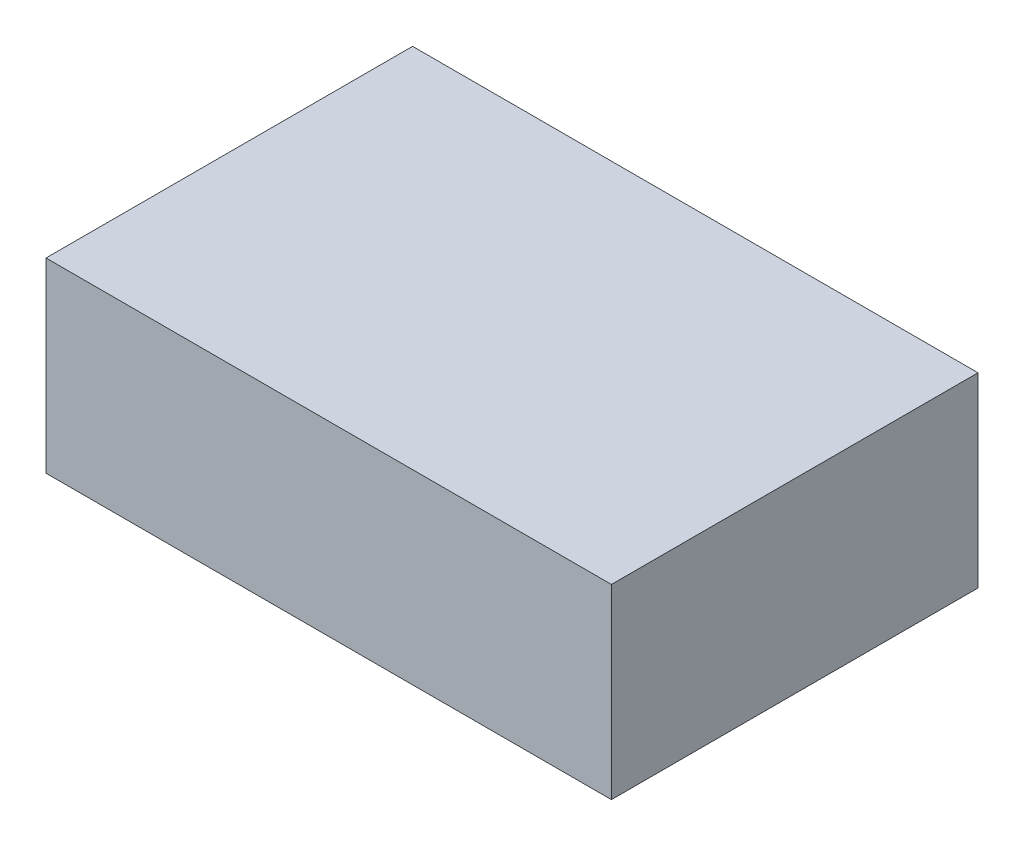
ISO-10303-21;
HEADER;
FILE_DESCRIPTION(('STEP AP214'),'2;1');
FILE_NAME('part.step','',(''),(''),'','','');
FILE_SCHEMA(('AUTOMOTIVE_DESIGN { 1 0 10303 214 1 1 1 1 }'));
ENDSEC;
DATA;
#1=APPLICATION_CONTEXT('core data for automotive mechanical design processes');
#2=APPLICATION_PROTOCOL_DEFINITION('international standard','automotive_design',2000,#1);
#3=PRODUCT_CONTEXT('',#1,'mechanical');
#4=PRODUCT('Part','Part','',(#3));
#5=PRODUCT_RELATED_PRODUCT_CATEGORY('part','',(#4));
#6=PRODUCT_DEFINITION_FORMATION('','',#4);
#7=PRODUCT_DEFINITION_CONTEXT('part definition',#1,'design');
#8=PRODUCT_DEFINITION('design','',#6,#7);
#9=PRODUCT_DEFINITION_SHAPE('','',#8);
#10=(LENGTH_UNIT() NAMED_UNIT(*) SI_UNIT(.MILLI.,.METRE.));
#11=(NAMED_UNIT(*) PLANE_ANGLE_UNIT() SI_UNIT($,.RADIAN.));
#12=(NAMED_UNIT(*) SI_UNIT($,.STERADIAN.) SOLID_ANGLE_UNIT());
#13=UNCERTAINTY_MEASURE_WITH_UNIT(LENGTH_MEASURE(1.E-05),#10,'distance_accuracy_value','');
#14=(GEOMETRIC_REPRESENTATION_CONTEXT(3) GLOBAL_UNCERTAINTY_ASSIGNED_CONTEXT((#13)) GLOBAL_UNIT_ASSIGNED_CONTEXT((#10,
#11,#12)) REPRESENTATION_CONTEXT('',''));
#15=CARTESIAN_POINT('',(0.,0.,0.));
#16=DIRECTION('',(0.,0.,1.));
#17=DIRECTION('',(1.,0.,0.));
#18=AXIS2_PLACEMENT_3D('',#15,#16,#17);
#19=CARTESIAN_POINT('',(0.,30.,0.));
#20=DIRECTION('',(1.,0.,0.));
#21=DIRECTION('',(0.,0.,-1.));
#22=AXIS2_PLACEMENT_3D('',#19,#20,#21);
#23=PLANE('',#22);
#24=DIRECTION('',(0.,0.,1.));
#25=VECTOR('',#24,1.);
#26=CARTESIAN_POINT('',(0.,0.,0.));
#27=LINE('',#26,#25);
#28=CARTESIAN_POINT('',(0.,0.,-59.));
#29=VERTEX_POINT('',#28);
#30=CARTESIAN_POINT('',(0.,0.,0.));
#31=VERTEX_POINT('',#30);
#32=EDGE_CURVE('E106',#29,#31,#27,.T.);
#33=ORIENTED_EDGE('',*,*,#32,.T.);
#34=DIRECTION('',(0.,-1.,0.));
#35=VECTOR('',#34,1.);
#36=CARTESIAN_POINT('',(0.,30.,0.));
#37=LINE('',#36,#35);
#38=CARTESIAN_POINT('',(0.,30.,0.));
#39=VERTEX_POINT('',#38);
#40=EDGE_CURVE('E11',#39,#31,#37,.T.);
#41=ORIENTED_EDGE('',*,*,#40,.F.);
#42=DIRECTION('',(0.,0.,1.));
#43=VECTOR('',#42,1.);
#44=CARTESIAN_POINT('',(0.,30.,0.));
#45=LINE('',#44,#43);
#46=CARTESIAN_POINT('',(0.,30.,-59.));
#47=VERTEX_POINT('',#46);
#48=EDGE_CURVE('E94',#47,#39,#45,.T.);
#49=ORIENTED_EDGE('',*,*,#48,.F.);
#50=DIRECTION('',(0.,-1.,0.));
#51=VECTOR('',#50,1.);
#52=CARTESIAN_POINT('',(0.,30.,-59.));
#53=LINE('',#52,#51);
#54=EDGE_CURVE('E102',#47,#29,#53,.T.);
#55=ORIENTED_EDGE('',*,*,#54,.T.);
#56=EDGE_LOOP('',(#33,#41,#49,#55));
#57=FACE_BOUND('',#56,.T.);
#58=ADVANCED_FACE('F43',(#57),#23,.F.);
#59=CARTESIAN_POINT('',(0.,30.,0.));
#60=DIRECTION('',(0.,0.,-1.));
#61=DIRECTION('',(-1.,0.,0.));
#62=AXIS2_PLACEMENT_3D('',#59,#60,#61);
#63=PLANE('',#62);
#64=DIRECTION('',(1.,0.,0.));
#65=VECTOR('',#64,1.);
#66=CARTESIAN_POINT('',(0.,0.,0.));
#67=LINE('',#66,#65);
#68=CARTESIAN_POINT('',(91.,0.,0.));
#69=VERTEX_POINT('',#68);
#70=EDGE_CURVE('E98',#31,#69,#67,.T.);
#71=ORIENTED_EDGE('',*,*,#70,.T.);
#72=DIRECTION('',(0.,-1.,0.));
#73=VECTOR('',#72,1.);
#74=CARTESIAN_POINT('',(91.,30.,0.));
#75=LINE('',#74,#73);
#76=CARTESIAN_POINT('',(91.,30.,0.));
#77=VERTEX_POINT('',#76);
#78=EDGE_CURVE('E51',#77,#69,#75,.T.);
#79=ORIENTED_EDGE('',*,*,#78,.F.);
#80=DIRECTION('',(1.,0.,0.));
#81=VECTOR('',#80,1.);
#82=CARTESIAN_POINT('',(0.,30.,0.));
#83=LINE('',#82,#81);
#84=EDGE_CURVE('E89',#39,#77,#83,.T.);
#85=ORIENTED_EDGE('',*,*,#84,.F.);
#86=ORIENTED_EDGE('',*,*,#40,.T.);
#87=EDGE_LOOP('',(#71,#79,#85,#86));
#88=FACE_BOUND('',#87,.T.);
#89=ADVANCED_FACE('F97',(#88),#63,.F.);
#90=CARTESIAN_POINT('',(91.,30.,0.));
#91=DIRECTION('',(-1.,0.,0.));
#92=DIRECTION('',(0.,0.,1.));
#93=AXIS2_PLACEMENT_3D('',#90,#91,#92);
#94=PLANE('',#93);
#95=DIRECTION('',(0.,0.,-1.));
#96=VECTOR('',#95,1.);
#97=CARTESIAN_POINT('',(91.,0.,0.));
#98=LINE('',#97,#96);
#99=CARTESIAN_POINT('',(91.,0.,-59.));
#100=VERTEX_POINT('',#99);
#101=EDGE_CURVE('E76',#69,#100,#98,.T.);
#102=ORIENTED_EDGE('',*,*,#101,.T.);
#103=DIRECTION('',(0.,-1.,0.));
#104=VECTOR('',#103,1.);
#105=CARTESIAN_POINT('',(91.,30.,-59.));
#106=LINE('',#105,#104);
#107=CARTESIAN_POINT('',(91.,30.,-59.));
#108=VERTEX_POINT('',#107);
#109=EDGE_CURVE('E99',#108,#100,#106,.T.);
#110=ORIENTED_EDGE('',*,*,#109,.F.);
#111=DIRECTION('',(0.,0.,-1.));
#112=VECTOR('',#111,1.);
#113=CARTESIAN_POINT('',(91.,30.,0.));
#114=LINE('',#113,#112);
#115=EDGE_CURVE('E92',#77,#108,#114,.T.);
#116=ORIENTED_EDGE('',*,*,#115,.F.);
#117=ORIENTED_EDGE('',*,*,#78,.T.);
#118=EDGE_LOOP('',(#102,#110,#116,#117));
#119=FACE_BOUND('',#118,.T.);
#120=ADVANCED_FACE('F100',(#119),#94,.F.);
#121=CARTESIAN_POINT('',(0.,30.,-59.));
#122=DIRECTION('',(0.,0.,1.));
#123=DIRECTION('',(1.,0.,0.));
#124=AXIS2_PLACEMENT_3D('',#121,#122,#123);
#125=PLANE('',#124);
#126=DIRECTION('',(-1.,0.,0.));
#127=VECTOR('',#126,1.);
#128=CARTESIAN_POINT('',(0.,0.,-59.));
#129=LINE('',#128,#127);
#130=EDGE_CURVE('E82',#100,#29,#129,.T.);
#131=ORIENTED_EDGE('',*,*,#130,.T.);
#132=ORIENTED_EDGE('',*,*,#54,.F.);
#133=DIRECTION('',(-1.,0.,0.));
#134=VECTOR('',#133,1.);
#135=CARTESIAN_POINT('',(0.,30.,-59.));
#136=LINE('',#135,#134);
#137=EDGE_CURVE('E59',#108,#47,#136,.T.);
#138=ORIENTED_EDGE('',*,*,#137,.F.);
#139=ORIENTED_EDGE('',*,*,#109,.T.);
#140=EDGE_LOOP('',(#131,#132,#138,#139));
#141=FACE_BOUND('',#140,.T.);
#142=ADVANCED_FACE('F113',(#141),#125,.F.);
#143=CARTESIAN_POINT('',(0.,30.,0.));
#144=DIRECTION('',(0.,-1.,0.));
#145=DIRECTION('',(0.,0.,-1.));
#146=AXIS2_PLACEMENT_3D('',#143,#144,#145);
#147=PLANE('',#146);
#148=ORIENTED_EDGE('',*,*,#48,.T.);
#149=ORIENTED_EDGE('',*,*,#84,.T.);
#150=ORIENTED_EDGE('',*,*,#115,.T.);
#151=ORIENTED_EDGE('',*,*,#137,.T.);
#152=EDGE_LOOP('',(#148,#149,#150,#151));
#153=FACE_BOUND('',#152,.T.);
#154=ADVANCED_FACE('F90',(#153),#147,.F.);
#155=CARTESIAN_POINT('',(0.,0.,0.));
#156=DIRECTION('',(0.,-1.,0.));
#157=DIRECTION('',(0.,0.,-1.));
#158=AXIS2_PLACEMENT_3D('',#155,#156,#157);
#159=PLANE('',#158);
#160=ORIENTED_EDGE('',*,*,#32,.F.);
#161=ORIENTED_EDGE('',*,*,#130,.F.);
#162=ORIENTED_EDGE('',*,*,#101,.F.);
#163=ORIENTED_EDGE('',*,*,#70,.F.);
#164=EDGE_LOOP('',(#160,#161,#162,#163));
#165=FACE_BOUND('',#164,.T.);
#166=ADVANCED_FACE('F116',(#165),#159,.T.);
#167=CLOSED_SHELL('',(#58,#89,#120,#142,#154,#166));
#168=MANIFOLD_SOLID_BREP('B2',#167);
#169=ADVANCED_BREP_SHAPE_REPRESENTATION('',(#18,#168),#14);
#170=SHAPE_DEFINITION_REPRESENTATION(#9,#169);
ENDSEC;
END-ISO-10303-21;
